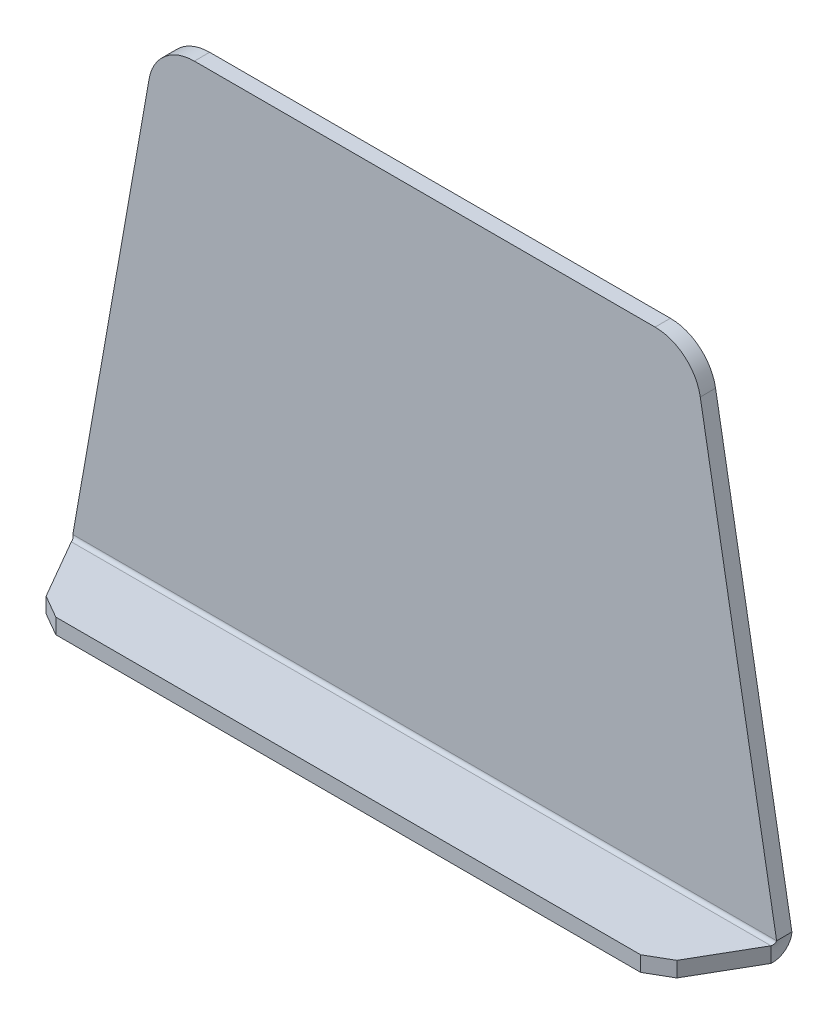
ISO-10303-21;
HEADER;
FILE_DESCRIPTION(('STEP AP214'),'2;1');
FILE_NAME('part.step','',(''),(''),'','','');
FILE_SCHEMA(('AUTOMOTIVE_DESIGN { 1 0 10303 214 1 1 1 1 }'));
ENDSEC;
DATA;
#1=APPLICATION_CONTEXT('core data for automotive mechanical design processes');
#2=APPLICATION_PROTOCOL_DEFINITION('international standard','automotive_design',2000,#1);
#3=PRODUCT_CONTEXT('',#1,'mechanical');
#4=PRODUCT('Part','Part','',(#3));
#5=PRODUCT_RELATED_PRODUCT_CATEGORY('part','',(#4));
#6=PRODUCT_DEFINITION_FORMATION('','',#4);
#7=PRODUCT_DEFINITION_CONTEXT('part definition',#1,'design');
#8=PRODUCT_DEFINITION('design','',#6,#7);
#9=PRODUCT_DEFINITION_SHAPE('','',#8);
#10=(LENGTH_UNIT() NAMED_UNIT(*) SI_UNIT(.MILLI.,.METRE.));
#11=(NAMED_UNIT(*) PLANE_ANGLE_UNIT() SI_UNIT($,.RADIAN.));
#12=(NAMED_UNIT(*) SI_UNIT($,.STERADIAN.) SOLID_ANGLE_UNIT());
#13=UNCERTAINTY_MEASURE_WITH_UNIT(LENGTH_MEASURE(1.E-05),#10,'distance_accuracy_value','');
#14=(GEOMETRIC_REPRESENTATION_CONTEXT(3) GLOBAL_UNCERTAINTY_ASSIGNED_CONTEXT((#13)) GLOBAL_UNIT_ASSIGNED_CONTEXT((#10,
#11,#12)) REPRESENTATION_CONTEXT('',''));
#15=CARTESIAN_POINT('',(0.,0.,0.));
#16=DIRECTION('',(0.,0.,1.));
#17=DIRECTION('',(1.,0.,0.));
#18=AXIS2_PLACEMENT_3D('',#15,#16,#17);
#19=CARTESIAN_POINT('',(0.,-0.7366,0.));
#20=DIRECTION('',(0.,1.,0.));
#21=DIRECTION('',(0.,0.,1.));
#22=AXIS2_PLACEMENT_3D('',#19,#20,#21);
#23=PLANE('',#22);
#24=DIRECTION('',(-0.500000000000017,0.,-0.866025403784429));
#25=VECTOR('',#24,1.);
#26=CARTESIAN_POINT('',(0.,-0.736599999999998,0.));
#27=LINE('',#26,#25);
#28=CARTESIAN_POINT('',(0.425276208285697,-0.736599999999999,0.736600000001023));
#29=VERTEX_POINT('',#28);
#30=CARTESIAN_POINT('',(7.57793552338496,-0.736599999999998,13.1253693429832));
#31=VERTEX_POINT('',#30);
#32=EDGE_CURVE('E137',#29,#31,#27,.F.);
#33=ORIENTED_EDGE('',*,*,#32,.T.);
#34=DIRECTION('',(-0.866025403784429,0.,-0.500000000000017));
#35=VECTOR('',#34,1.);
#36=CARTESIAN_POINT('',(7.5779355233849,-0.7366,13.1253693429833));
#37=LINE('',#36,#35);
#38=CARTESIAN_POINT('',(12.3404355233852,-0.7366,15.8749999999997));
#39=VERTEX_POINT('',#38);
#40=EDGE_CURVE('E170',#31,#39,#37,.F.);
#41=ORIENTED_EDGE('',*,*,#40,.T.);
#42=DIRECTION('',(-1.,0.,0.));
#43=VECTOR('',#42,1.);
#44=CARTESIAN_POINT('',(9.1654355233849,-0.7366,15.875));
#45=LINE('',#44,#43);
#46=CARTESIAN_POINT('',(133.709564476603,-0.7366,15.8749999999999));
#47=VERTEX_POINT('',#46);
#48=EDGE_CURVE('E159',#39,#47,#45,.F.);
#49=ORIENTED_EDGE('',*,*,#48,.T.);
#50=DIRECTION('',(-0.866025403784429,0.,0.500000000000017));
#51=VECTOR('',#50,1.);
#52=CARTESIAN_POINT('',(133.709564476602,-0.7366,15.875));
#53=LINE('',#52,#51);
#54=CARTESIAN_POINT('',(138.472064476603,-0.736599999999998,13.1253693429839));
#55=VERTEX_POINT('',#54);
#56=EDGE_CURVE('E146',#47,#55,#53,.F.);
#57=ORIENTED_EDGE('',*,*,#56,.T.);
#58=DIRECTION('',(-0.500000000000017,0.,0.866025403784429));
#59=VECTOR('',#58,1.);
#60=CARTESIAN_POINT('',(136.884564476602,-0.736599999999998,15.875));
#61=LINE('',#60,#59);
#62=CARTESIAN_POINT('',(145.624723791707,-0.736599999999999,0.736600000003302));
#63=VERTEX_POINT('',#62);
#64=EDGE_CURVE('E140',#55,#63,#61,.F.);
#65=ORIENTED_EDGE('',*,*,#64,.T.);
#66=DIRECTION('',(1.,0.,0.));
#67=VECTOR('',#66,1.);
#68=CARTESIAN_POINT('',(146.05,-0.7366,0.736600000002032));
#69=LINE('',#68,#67);
#70=EDGE_CURVE('E100',#63,#29,#69,.F.);
#71=ORIENTED_EDGE('',*,*,#70,.T.);
#72=EDGE_LOOP('',(#33,#41,#49,#57,#65,#71));
#73=FACE_BOUND('',#72,.T.);
#74=ADVANCED_FACE('F33',(#73),#23,.T.);
#75=CARTESIAN_POINT('',(7.5779355233849,-3.9116,13.1253693429833));
#76=DIRECTION('',(0.500000000000017,0.,-0.866025403784429));
#77=DIRECTION('',(-0.866025403784429,0.,-0.500000000000017));
#78=AXIS2_PLACEMENT_3D('',#75,#76,#77);
#79=PLANE('',#78);
#80=DIRECTION('',(0.,1.,0.));
#81=VECTOR('',#80,1.);
#82=CARTESIAN_POINT('',(12.3404355233851,-3.9116,15.875));
#83=LINE('',#82,#81);
#84=CARTESIAN_POINT('',(12.3404355233851,-3.9116,15.8749999999999));
#85=VERTEX_POINT('',#84);
#86=EDGE_CURVE('E167',#85,#39,#83,.T.);
#87=ORIENTED_EDGE('',*,*,#86,.T.);
#88=ORIENTED_EDGE('',*,*,#40,.F.);
#89=DIRECTION('',(0.,1.,0.));
#90=VECTOR('',#89,1.);
#91=CARTESIAN_POINT('',(7.57793552338497,-3.9116,13.1253693429832));
#92=LINE('',#91,#90);
#93=CARTESIAN_POINT('',(7.57793552338487,-3.91159993262504,13.1253693429831));
#94=VERTEX_POINT('',#93);
#95=EDGE_CURVE('E136',#31,#94,#92,.F.);
#96=ORIENTED_EDGE('',*,*,#95,.T.);
#97=DIRECTION('',(0.866025403784356,0.,0.500000000000143));
#98=VECTOR('',#97,1.);
#99=CARTESIAN_POINT('',(7.57793552338482,-3.9116,13.1253693429831));
#100=LINE('',#99,#98);
#101=EDGE_CURVE('E164',#94,#85,#100,.T.);
#102=ORIENTED_EDGE('',*,*,#101,.T.);
#103=EDGE_LOOP('',(#87,#88,#96,#102));
#104=FACE_BOUND('',#103,.T.);
#105=ADVANCED_FACE('F341',(#104),#79,.F.);
#106=CARTESIAN_POINT('',(9.1654355233849,-3.9116,15.875));
#107=DIRECTION('',(0.,0.,-1.));
#108=DIRECTION('',(-1.,0.,0.));
#109=AXIS2_PLACEMENT_3D('',#106,#107,#108);
#110=PLANE('',#109);
#111=DIRECTION('',(0.,1.,0.));
#112=VECTOR('',#111,1.);
#113=CARTESIAN_POINT('',(133.709564476603,-3.9116,15.8749999999998));
#114=LINE('',#113,#112);
#115=CARTESIAN_POINT('',(133.709564476603,-3.9116,15.8749999999998));
#116=VERTEX_POINT('',#115);
#117=EDGE_CURVE('E156',#116,#47,#114,.T.);
#118=ORIENTED_EDGE('',*,*,#117,.T.);
#119=ORIENTED_EDGE('',*,*,#48,.F.);
#120=ORIENTED_EDGE('',*,*,#86,.F.);
#121=DIRECTION('',(1.,0.,0.));
#122=VECTOR('',#121,1.);
#123=CARTESIAN_POINT('',(0.,-3.9116,15.8749999999999));
#124=LINE('',#123,#122);
#125=EDGE_CURVE('E153',#85,#116,#124,.T.);
#126=ORIENTED_EDGE('',*,*,#125,.T.);
#127=EDGE_LOOP('',(#118,#119,#120,#126));
#128=FACE_BOUND('',#127,.T.);
#129=ADVANCED_FACE('F340',(#128),#110,.F.);
#130=CARTESIAN_POINT('',(133.709564476602,-3.9116,15.875));
#131=DIRECTION('',(-0.500000000000017,0.,-0.866025403784429));
#132=DIRECTION('',(-0.866025403784429,0.,0.500000000000017));
#133=AXIS2_PLACEMENT_3D('',#130,#131,#132);
#134=PLANE('',#133);
#135=DIRECTION('',(0.,1.,0.));
#136=VECTOR('',#135,1.);
#137=CARTESIAN_POINT('',(138.472064476603,-3.9116,13.1253693429838));
#138=LINE('',#137,#136);
#139=CARTESIAN_POINT('',(138.472064476603,-3.9116,13.1253693429837));
#140=VERTEX_POINT('',#139);
#141=EDGE_CURVE('E143',#140,#55,#138,.T.);
#142=ORIENTED_EDGE('',*,*,#141,.T.);
#143=ORIENTED_EDGE('',*,*,#56,.F.);
#144=ORIENTED_EDGE('',*,*,#117,.F.);
#145=DIRECTION('',(0.866025403784358,0.,-0.50000000000014));
#146=VECTOR('',#145,1.);
#147=CARTESIAN_POINT('',(133.709564476603,-3.9116,15.8749999999999));
#148=LINE('',#147,#146);
#149=EDGE_CURVE('E149',#116,#140,#148,.T.);
#150=ORIENTED_EDGE('',*,*,#149,.T.);
#151=EDGE_LOOP('',(#142,#143,#144,#150));
#152=FACE_BOUND('',#151,.T.);
#153=ADVANCED_FACE('F336',(#152),#134,.F.);
#154=CARTESIAN_POINT('',(136.884564476602,-3.9116,15.875));
#155=DIRECTION('',(-0.866025403784429,0.,-0.500000000000017));
#156=DIRECTION('',(-0.500000000000017,0.,0.866025403784429));
#157=AXIS2_PLACEMENT_3D('',#154,#155,#156);
#158=PLANE('',#157);
#159=ORIENTED_EDGE('',*,*,#141,.F.);
#160=DIRECTION('',(0.500000000000639,0.,-0.86602540378407));
#161=VECTOR('',#160,1.);
#162=CARTESIAN_POINT('',(138.472064476602,-3.9116,13.1253693429836));
#163=LINE('',#162,#161);
#164=CARTESIAN_POINT('',(145.624723791718,-3.9116,0.736600000017147));
#165=VERTEX_POINT('',#164);
#166=EDGE_CURVE('E152',#140,#165,#163,.T.);
#167=ORIENTED_EDGE('',*,*,#166,.T.);
#168=DIRECTION('',(3.71810476437757E-12,-1.,8.74416762703518E-12));
#169=VECTOR('',#168,1.);
#170=CARTESIAN_POINT('',(145.624723791716,-2.3241794487742,0.736600000020483));
#171=LINE('',#170,#169);
#172=EDGE_CURVE('E102',#63,#165,#171,.T.);
#173=ORIENTED_EDGE('',*,*,#172,.F.);
#174=ORIENTED_EDGE('',*,*,#64,.F.);
#175=EDGE_LOOP('',(#159,#167,#173,#174));
#176=FACE_BOUND('',#175,.T.);
#177=ADVANCED_FACE('F285',(#176),#158,.F.);
#178=CARTESIAN_POINT('',(0.,-3.9116,0.));
#179=DIRECTION('',(0.866025403784429,0.,-0.500000000000017));
#180=DIRECTION('',(-0.500000000000017,0.,-0.866025403784429));
#181=AXIS2_PLACEMENT_3D('',#178,#179,#180);
#182=PLANE('',#181);
#183=ORIENTED_EDGE('',*,*,#95,.F.);
#184=ORIENTED_EDGE('',*,*,#32,.F.);
#185=DIRECTION('',(0.,1.,0.));
#186=VECTOR('',#185,1.);
#187=CARTESIAN_POINT('',(0.425276208285051,-2.32417944833777,0.736600000000027));
#188=LINE('',#187,#186);
#189=CARTESIAN_POINT('',(0.425276208285079,-3.9116,0.736599999999962));
#190=VERTEX_POINT('',#189);
#191=EDGE_CURVE('E259',#190,#29,#188,.T.);
#192=ORIENTED_EDGE('',*,*,#191,.F.);
#193=DIRECTION('',(0.500000000000011,0.,0.866025403784432));
#194=VECTOR('',#193,1.);
#195=CARTESIAN_POINT('',(0.425276208285123,-3.9116,0.736599999999977));
#196=LINE('',#195,#194);
#197=EDGE_CURVE('E175',#190,#94,#196,.T.);
#198=ORIENTED_EDGE('',*,*,#197,.T.);
#199=EDGE_LOOP('',(#183,#184,#192,#198));
#200=FACE_BOUND('',#199,.T.);
#201=ADVANCED_FACE('F252',(#200),#182,.F.);
#202=CARTESIAN_POINT('',(146.05,0.,0.7366));
#203=DIRECTION('',(1.,0.,0.));
#204=DIRECTION('',(0.,0.,-1.));
#205=AXIS2_PLACEMENT_3D('',#202,#203,#204);
#206=CYLINDRICAL_SURFACE('',#205,0.7366);
#207=CARTESIAN_POINT('',(0.425276208285126,-0.7366,0.736600000000531));
#208=CARTESIAN_POINT('',(0.409037997312572,-0.736645532031215,0.692411098372746));
#209=CARTESIAN_POINT('',(0.392800219051534,-0.732626542664837,0.648236597919797));
#210=CARTESIAN_POINT('',(0.360337381365451,-0.716794915196089,0.561343013066807));
#211=CARTESIAN_POINT('',(0.344112322585992,-0.70498875735479,0.518622749550487));
#212=CARTESIAN_POINT('',(0.311650856670122,-0.673908610866465,0.435963430839832));
#213=CARTESIAN_POINT('',(0.295414448204086,-0.654630514028472,0.396025919923243));
#214=CARTESIAN_POINT('',(0.262951298600167,-0.609247546599992,0.320252361012712));
#215=CARTESIAN_POINT('',(0.246724556035522,-0.583144522308115,0.28441520754209));
#216=CARTESIAN_POINT('',(0.214268537867195,-0.524956867281631,0.217996684682297));
#217=CARTESIAN_POINT('',(0.198039263522983,-0.492873501467408,0.187414206484605));
#218=CARTESIAN_POINT('',(0.165587315655498,-0.423751996807005,0.132479270520449));
#219=CARTESIAN_POINT('',(0.1493646419367,-0.386714017364265,0.108126612397055));
#220=CARTESIAN_POINT('',(0.116903065795082,-0.308862734561762,0.066423617463884));
#221=CARTESIAN_POINT('',(0.100664160019311,-0.268046774011185,0.0490782558487671));
#222=CARTESIAN_POINT('',(0.0682041350426444,-0.183997586516805,0.0219897426930793));
#223=CARTESIAN_POINT('',(0.0519830227925626,-0.140767825917321,0.0122359755743467));
#224=CARTESIAN_POINT('',(0.0298109572965363,-0.0809668785520732,0.00428223907434488));
#225=CARTESIAN_POINT('',(0.0238433380752711,-0.0648007299525648,0.00267577956754168));
#226=CARTESIAN_POINT('',(0.0119180842765506,-0.0324253547510727,0.000536012446991294));
#227=CARTESIAN_POINT('',(0.00596045006027034,-0.0162162489422923,8.75978410633538E-07));
#228=CARTESIAN_POINT('',(0.,-1.009528956236E-13,0.));
#229=B_SPLINE_CURVE_WITH_KNOTS('',3,(#207,#208,#209,#210,#211,#212,#213,#214,#215,#216,#217,
#218,#219,#220,#221,#222,#223,#224,#225,#226,#227,#228),.UNSPECIFIED.,.F.,.F.,(4,2,2,2,2,2,2,2,
2,2,4),(0.,0.141043225038912,0.281969225734052,0.422972819954025,0.563938308880143,
0.704874015526822,0.845805188977319,0.986836248727672,1.1276697439906,1.1795657073121,
1.23137300326773),.UNSPECIFIED.);
#230=CARTESIAN_POINT('',(2.72203961802735E-13,0.,0.));
#231=VERTEX_POINT('',#230);
#232=EDGE_CURVE('E113',#29,#231,#229,.T.);
#233=ORIENTED_EDGE('',*,*,#232,.F.);
#234=ORIENTED_EDGE('',*,*,#70,.F.);
#235=CARTESIAN_POINT('',(146.04999999999,1.10416885987528E-12,0.));
#236=CARTESIAN_POINT('',(146.033761789014,-0.0441889016253997,-4.55320315063034E-05));
#237=CARTESIAN_POINT('',(146.017524010753,-0.088363402078439,0.00397345733484365));
#238=CARTESIAN_POINT('',(145.985061173071,-0.175256986932504,0.0198050848037844));
#239=CARTESIAN_POINT('',(145.968836114294,-0.217977250449806,0.0316112426453038));
#240=CARTESIAN_POINT('',(145.936374648382,-0.300636569161503,0.0626913891340544));
#241=CARTESIAN_POINT('',(145.920138239916,-0.340574080078149,0.0819694859722547));
#242=CARTESIAN_POINT('',(145.887675090312,-0.416347638988351,0.127352453400751));
#243=CARTESIAN_POINT('',(145.871448347746,-0.452184792458588,0.153455477692438));
#244=CARTESIAN_POINT('',(145.838992329576,-0.518603315317709,0.211643132718414));
#245=CARTESIAN_POINT('',(145.822763055231,-0.549185793515125,0.243726498532311));
#246=CARTESIAN_POINT('',(145.790311107363,-0.604120729478959,0.312848003192191));
#247=CARTESIAN_POINT('',(145.774088433644,-0.628473387602309,0.349885982634734));
#248=CARTESIAN_POINT('',(145.741626857501,-0.670176382535689,0.427737265437253));
#249=CARTESIAN_POINT('',(145.725387951725,-0.687521744150972,0.468553225988092));
#250=CARTESIAN_POINT('',(145.692927926748,-0.71461025730696,0.552602413483231));
#251=CARTESIAN_POINT('',(145.676706814498,-0.724364024425833,0.59583217408321));
#252=CARTESIAN_POINT('',(145.654534749005,-0.732317760925926,0.65563312145027));
#253=CARTESIAN_POINT('',(145.648567129784,-0.733924220432747,0.671799270050513));
#254=CARTESIAN_POINT('',(145.636641875988,-0.736063987553237,0.704174645253672));
#255=CARTESIAN_POINT('',(145.630684241773,-0.736599124021739,0.720383751063386));
#256=CARTESIAN_POINT('',(145.624723791714,-0.7366,0.736600000006618));
#257=B_SPLINE_CURVE_WITH_KNOTS('',3,(#235,#236,#237,#238,#239,#240,#241,#242,#243,#244,#245,
#246,#247,#248,#249,#250,#251,#252,#253,#254,#255,#256),.UNSPECIFIED.,.F.,.F.,(4,2,2,2,2,2,2,2,
2,2,4),(0.,0.1410432250387,0.281969225733606,0.42297281995342,0.563938308879383,
0.704874015525665,0.845805188975765,0.986836248727495,1.12766974399172,1.17956570731438,
1.23137300327115),.UNSPECIFIED.);
#258=CARTESIAN_POINT('',(146.04999999999,-1.10579937885499E-13,0.));
#259=VERTEX_POINT('',#258);
#260=EDGE_CURVE('E40',#259,#63,#257,.T.);
#261=ORIENTED_EDGE('',*,*,#260,.F.);
#262=DIRECTION('',(-1.,0.,0.));
#263=VECTOR('',#262,1.);
#264=CARTESIAN_POINT('',(0.,2.5943691639437E-13,0.));
#265=LINE('',#264,#263);
#266=EDGE_CURVE('E98',#259,#231,#265,.T.);
#267=ORIENTED_EDGE('',*,*,#266,.T.);
#268=EDGE_LOOP('',(#233,#234,#261,#267));
#269=FACE_BOUND('',#268,.T.);
#270=ADVANCED_FACE('F97',(#269),#206,.F.);
#271=CARTESIAN_POINT('',(145.587612544005,-4.08738304657646,1.30062531070989));
#272=CARTESIAN_POINT('',(145.587613050227,-2.8970504975562,1.13636788014082));
#273=CARTESIAN_POINT('',(145.587613556423,-1.70671794853797,0.972110449572012));
#274=CARTESIAN_POINT('',(145.58761406262,-0.516385399518982,0.807853019003202));
#275=CARTESIAN_POINT('',(145.599984752966,-4.11389296873304,1.11373103709075));
#276=CARTESIAN_POINT('',(145.599985013113,-2.91584016529048,1.00390181703589));
#277=CARTESIAN_POINT('',(145.59998527326,-1.71778736184614,0.89407259698077));
#278=CARTESIAN_POINT('',(145.599985533432,-0.519734558402312,0.784243376925908));
#279=CARTESIAN_POINT('',(145.647805286687,-4.16445919940632,0.384702751266314));
#280=CARTESIAN_POINT('',(145.647804928217,-2.9516804357434,0.487183613372252));
#281=CARTESIAN_POINT('',(145.647804569721,-1.73890167207972,0.589664475478444));
#282=CARTESIAN_POINT('',(145.647804211251,-0.526122908416798,0.692145337584382));
#283=CARTESIAN_POINT('',(145.731039991693,-3.91208361052884,-0.883754332543426));
#284=CARTESIAN_POINT('',(145.73104011468,-2.7728019939582,-0.411873159233492));
#285=CARTESIAN_POINT('',(145.731040237641,-1.63352037739061,0.0600080140765182));
#286=CARTESIAN_POINT('',(145.731040360628,-0.494238760822,0.531889187386376));
#287=CARTESIAN_POINT('',(145.837361895838,-2.99420532751336,-2.25760532654384));
#288=CARTESIAN_POINT('',(145.837361895838,-2.12222919865427,-1.38562919796898));
#289=CARTESIAN_POINT('',(145.837361895838,-1.25025306979595,-0.513653069394372));
#290=CARTESIAN_POINT('',(145.837361895838,-0.378276940937874,0.35832305918049));
#291=CARTESIAN_POINT('',(145.943683800085,-1.62035432965951,-3.17548361151944));
#292=CARTESIAN_POINT('',(145.943683677098,-1.14847315719413,-2.03620199466076));
#293=CARTESIAN_POINT('',(145.943683554112,-0.676591984728996,-0.89692037780285));
#294=CARTESIAN_POINT('',(145.943683431125,-0.204710812263688,0.242361239054861));
#295=CARTESIAN_POINT('',(146.026923596928,-0.351819656636902,-3.42787463672622));
#296=CARTESIAN_POINT('',(146.026923955423,-0.249361390903069,-2.21509137738751));
#297=CARTESIAN_POINT('',(146.026924313919,-0.146903125169235,-1.00230811804905));
#298=CARTESIAN_POINT('',(146.026924672414,-0.0444448594354018,0.21047514128916));
#299=CARTESIAN_POINT('',(146.074749227311,0.377286366246688,-3.377282194622));
#300=CARTESIAN_POINT('',(146.074748967012,0.267411910700382,-2.17923252882849));
#301=CARTESIAN_POINT('',(146.074748706713,0.157537455154152,-0.981182863033702));
#302=CARTESIAN_POINT('',(146.074748446414,0.0476629996078208,0.21686680276093));
#303=CARTESIAN_POINT('',(146.087126533037,0.564256217279822,-3.35075029134352));
#304=CARTESIAN_POINT('',(146.08712602651,0.399931541018478,-2.16042728134431));
#305=CARTESIAN_POINT('',(146.087125519983,0.235606864757236,-0.970104271346124));
#306=CARTESIAN_POINT('',(146.087125013482,0.071282188495917,0.220218738652041));
#307=B_SPLINE_SURFACE_WITH_KNOTS('',3,3,((#271,#272,#273,#274),(#275,#276,#277,#278),(#279,#280,
#281,#282),(#283,#284,#285,#286),(#287,#288,#289,#290),(#291,#292,#293,#294),(#295,#296,#297,
#298),(#299,#300,#301,#302),(#303,#304,#305,#306)),.UNSPECIFIED.,.F.,.F.,.F.,(4,1,1,1,1,1,4),(4,
4),(-0.08723626480821,0.,0.2500000000036,0.5000000000014,0.7499999999991,1.,1.087272189861),
(4.543612969893E-08,0.9999983845735),.UNSPECIFIED.);
#308=CARTESIAN_POINT('',(146.050000000012,-1.38098531700796E-12,-3.175));
#309=CARTESIAN_POINT('',(146.042366379942,-0.110287051827272,-3.1750106504649));
#310=CARTESIAN_POINT('',(146.034733349952,-0.220569103956156,-3.17033574655555));
#311=CARTESIAN_POINT('',(146.019468097599,-0.440340357702249,-3.15169721503875));
#312=CARTESIAN_POINT('',(146.011835875214,-0.549829597303804,-3.13773403545746));
#313=CARTESIAN_POINT('',(145.99657690979,-0.767160833072922,-3.10061538433097));
#314=CARTESIAN_POINT('',(145.988950166979,-0.875004013999934,-3.07746688270374));
#315=CARTESIAN_POINT('',(145.973697635792,-1.0883240570705,-3.02216621495015));
#316=CARTESIAN_POINT('',(145.966071847405,-1.19380094819719,-2.99001415916756));
#317=CARTESIAN_POINT('',(145.943187600084,-1.50565949116431,-2.88031381871406));
#318=CARTESIAN_POINT('',(145.927916173151,-1.70755692063788,-2.78950626613425));
#319=CARTESIAN_POINT('',(145.897391584483,-2.09304157278728,-2.57526926086313));
#320=CARTESIAN_POINT('',(145.882138419965,-2.27663206998096,-2.45184565659623));
#321=CARTESIAN_POINT('',(145.851623266357,-2.62045073735816,-2.17585904842733));
#322=CARTESIAN_POINT('',(145.836361277541,-2.78067959717662,-2.02329690500151));
#323=CARTESIAN_POINT('',(145.805840405345,-3.07320364485436,-1.69334983956939));
#324=CARTESIAN_POINT('',(145.790581523229,-3.20549314300714,-1.51595987371127));
#325=CARTESIAN_POINT('',(145.760058137519,-3.43835377276593,-1.14142802738979));
#326=CARTESIAN_POINT('',(145.744793633414,-3.53891840324435,-0.944282109386753));
#327=CARTESIAN_POINT('',(145.714267861358,-3.70538095861549,-0.535920177982778));
#328=CARTESIAN_POINT('',(145.69900659717,-3.77130012039346,-0.324712873568563));
#329=CARTESIAN_POINT('',(145.673908650463,-3.849760815651,0.0293177148548527));
#330=CARTESIAN_POINT('',(145.664064602811,-3.87293787192357,0.169874407033383));
#331=CARTESIAN_POINT('',(145.644390251639,-3.903854455118,0.452467602051468));
#332=CARTESIAN_POINT('',(145.634559949003,-3.91161643825406,0.594501648836051));
#333=CARTESIAN_POINT('',(145.624723791727,-3.91159999999999,0.736600000014321));
#334=B_SPLINE_CURVE_WITH_KNOTS('',3,(#308,#309,#310,#311,#312,#313,#314,#315,#316,#317,#318,
#319,#320,#321,#322,#323,#324,#325,#326,#327,#328,#329,#330,#331,#332,#333),.UNSPECIFIED.,.F.,
.F.,(4,2,2,2,2,2,2,2,2,2,2,2,4),(0.,0.331544885302929,0.663073779477026,0.994351585685525,
1.3256253320707,1.9879079977878,2.6500719892689,3.31221642972612,3.97449558273063,
4.63691036336615,5.29891862381988,5.726519843042,6.15349768742011),.UNSPECIFIED.);
#335=CARTESIAN_POINT('',(146.050000000001,-1.19016658650738E-12,-3.175));
#336=VERTEX_POINT('',#335);
#337=EDGE_CURVE('E59',#336,#165,#334,.T.);
#338=DIRECTION('',(0.,0.,1.));
#339=VECTOR('',#338,1.);
#340=CARTESIAN_POINT('',(146.049999999991,-1.31838984174237E-12,-3.175));
#341=LINE('',#340,#339);
#342=EDGE_CURVE('E115',#259,#336,#341,.F.);
#343=ORIENTED_EDGE('',*,*,#337,.F.);
#344=ORIENTED_EDGE('',*,*,#342,.F.);
#345=ORIENTED_EDGE('',*,*,#260,.T.);
#346=ORIENTED_EDGE('',*,*,#172,.T.);
#347=EDGE_LOOP('',(#343,#344,#345,#346));
#348=FACE_BOUND('',#347,.T.);
#349=ADVANCED_FACE('F116',(#348),#307,.T.);
#350=CARTESIAN_POINT('',(0.,-3.9116,0.));
#351=DIRECTION('',(0.,1.,0.));
#352=DIRECTION('',(0.,0.,1.));
#353=AXIS2_PLACEMENT_3D('',#350,#351,#352);
#354=PLANE('',#353);
#355=ORIENTED_EDGE('',*,*,#149,.F.);
#356=ORIENTED_EDGE('',*,*,#125,.F.);
#357=ORIENTED_EDGE('',*,*,#101,.F.);
#358=ORIENTED_EDGE('',*,*,#197,.F.);
#359=DIRECTION('',(1.,0.,0.));
#360=VECTOR('',#359,1.);
#361=CARTESIAN_POINT('',(146.05,-3.9116,0.736599999999931));
#362=LINE('',#361,#360);
#363=EDGE_CURVE('E213',#165,#190,#362,.F.);
#364=ORIENTED_EDGE('',*,*,#363,.F.);
#365=ORIENTED_EDGE('',*,*,#166,.F.);
#366=EDGE_LOOP('',(#355,#356,#357,#358,#364,#365));
#367=FACE_BOUND('',#366,.T.);
#368=ADVANCED_FACE('F246',(#367),#354,.F.);
#369=CARTESIAN_POINT('',(-0.0371112477279784,0.564025310545294,-3.35078304571794));
#370=CARTESIAN_POINT('',(-0.0371107415195166,0.399767880029316,-2.16045049698521));
#371=CARTESIAN_POINT('',(-0.0371102353110294,0.23551044951344,-0.970117948252476));
#372=CARTESIAN_POINT('',(-0.0371097291025676,0.0712530189974616,0.22021460048018));
#373=CARTESIAN_POINT('',(-0.0247390387692429,0.37713103697213,-3.3772929678669));
#374=CARTESIAN_POINT('',(-0.0247387786113913,0.267301816955114,-2.17924016471238));
#375=CARTESIAN_POINT('',(-0.0247385184535372,0.157472596938047,-0.981187361557598));
#376=CARTESIAN_POINT('',(-0.0247382582956857,0.0476433769210058,0.216865441597231));
#377=CARTESIAN_POINT('',(0.02308149496865,-0.351897248678568,-3.4278591985224));
#378=CARTESIAN_POINT('',(0.0230811364953284,-0.249416386591883,-2.2150804351531));
#379=CARTESIAN_POINT('',(0.0230807780220092,-0.146935524505122,-1.00230167178482));
#380=CARTESIAN_POINT('',(0.0230804195486901,-0.0444546624183866,0.21047709158338));
#381=CARTESIAN_POINT('',(0.106316199983177,-1.62035433220078,-3.17548360969826));
#382=CARTESIAN_POINT('',(0.106316322962306,-1.14847315900489,-2.03620199340677));
#383=CARTESIAN_POINT('',(0.106316445941435,-0.676591985809258,-0.89692037711451));
#384=CARTESIAN_POINT('',(0.106316568920564,-0.204710812613599,0.242361239178));
#385=CARTESIAN_POINT('',(0.21263810413018,-2.99420532591062,-2.25760532687861));
#386=CARTESIAN_POINT('',(0.212638104130714,-2.12222919754683,-1.38562919823162));
#387=CARTESIAN_POINT('',(0.212638104131247,-1.2502530691833,-0.513653069584872));
#388=CARTESIAN_POINT('',(0.21263810413178,-0.37827694081951,0.358323059062126));
#389=CARTESIAN_POINT('',(0.318960008351504,-3.91208361068886,-0.883754329316864));
#390=CARTESIAN_POINT('',(0.318959885370038,-2.77280199410806,-0.41187315696578));
#391=CARTESIAN_POINT('',(0.318959762388826,-1.63352037752675,0.060008015385431));
#392=CARTESIAN_POINT('',(0.31895963940736,-0.49423876094519,0.531889187736388));
#393=CARTESIAN_POINT('',(0.40219980519873,-4.1644746358423,0.384780343425328));
#394=CARTESIAN_POINT('',(0.40220016370703,-2.95169137679848,0.487238609138054));
#395=CARTESIAN_POINT('',(0.402200522215076,-1.73890811775466,0.589696874850526));
#396=CARTESIAN_POINT('',(0.402200880723122,-0.526124858710586,0.692155140563252));
#397=CARTESIAN_POINT('',(0.450025435581822,-4.11388219375332,1.11388636614229));
#398=CARTESIAN_POINT('',(0.45002517528821,-2.91583252824962,1.00401191062977));
#399=CARTESIAN_POINT('',(0.450024914994598,-1.71778286274389,0.894137455117246));
#400=CARTESIAN_POINT('',(0.450024654700986,-0.519733197239172,0.784262999604722));
#401=CARTESIAN_POINT('',(0.462402741310778,-4.08735029047992,1.30085621712996));
#402=CARTESIAN_POINT('',(0.462402234790582,-2.89702728077002,1.13653154091739));
#403=CARTESIAN_POINT('',(0.46240172827064,-1.70670427105885,0.97220686470481));
#404=CARTESIAN_POINT('',(0.462401221750444,-0.516381261348442,0.80788218849198));
#405=B_SPLINE_SURFACE_WITH_KNOTS('',3,3,((#369,#370,#371,#372),(#373,#374,#375,#376),(#377,#378,
#379,#380),(#381,#382,#383,#384),(#385,#386,#387,#388),(#389,#390,#391,#392),(#393,#394,#395,
#396),(#397,#398,#399,#400),(#401,#402,#403,#404)),.UNSPECIFIED.,.F.,.F.,.F.,(4,1,1,1,1,1,4),(4,
4),(-0.08723626480589,0.,0.2499999999998,0.4999999999998,0.7499999999997,1.,1.08727218986),
(4.505509384328E-08,0.9999983845735),.UNSPECIFIED.);
#406=DIRECTION('',(0.,0.,1.));
#407=VECTOR('',#406,1.);
#408=CARTESIAN_POINT('',(0.,-1.56727336311572E-13,-3.175));
#409=LINE('',#408,#407);
#410=CARTESIAN_POINT('',(2.22507802339415E-13,-3.40509861090282E-13,-3.175));
#411=VERTEX_POINT('',#410);
#412=EDGE_CURVE('E134',#411,#231,#409,.T.);
#413=CARTESIAN_POINT('',(0.425276208285082,-3.9116,0.73659999999994));
#414=CARTESIAN_POINT('',(0.417642588215209,-3.91161065046493,0.626312948174086));
#415=CARTESIAN_POINT('',(0.410009558225255,-3.90693574655563,0.516030896045251));
#416=CARTESIAN_POINT('',(0.394744305871504,-3.88829721503892,0.296259642299259));
#417=CARTESIAN_POINT('',(0.387112083486511,-3.87433403545768,0.186770402697756));
#418=CARTESIAN_POINT('',(0.371853118062376,-3.8372153843313,-0.0305608330712728));
#419=CARTESIAN_POINT('',(0.364226375251217,-3.81406688270412,-0.138404013998248));
#420=CARTESIAN_POINT('',(0.348973844063801,-3.75876621495065,-0.351724057068757));
#421=CARTESIAN_POINT('',(0.341348055676994,-3.72661415916812,-0.457200948195431));
#422=CARTESIAN_POINT('',(0.318463808356455,-3.61691381871478,-0.769059491162571));
#423=CARTESIAN_POINT('',(0.303192381425547,-3.52610626613506,-0.970956920636232));
#424=CARTESIAN_POINT('',(0.272667792761879,-3.31186926086402,-1.35644157278587));
#425=CARTESIAN_POINT('',(0.257414628246534,-3.18844565659713,-1.54003206997969));
#426=CARTESIAN_POINT('',(0.226899474643107,-2.91245904842836,-1.88385073735699));
#427=CARTESIAN_POINT('',(0.211637485828876,-2.75989690500269,-2.04407959717544));
#428=CARTESIAN_POINT('',(0.181116613634885,-2.42994983957096,-2.33660364485311));
#429=CARTESIAN_POINT('',(0.165857731518638,-2.25255987371308,-2.46889314300585));
#430=CARTESIAN_POINT('',(0.13533434580836,-1.87802802739212,-2.70175377276465));
#431=CARTESIAN_POINT('',(0.120069841703048,-1.68088210938934,-2.80231840324311));
#432=CARTESIAN_POINT('',(0.0895440696449873,-1.27252017798591,-2.96878095861441));
#433=CARTESIAN_POINT('',(0.0742828054551584,-1.06131287357198,-3.03470012039248));
#434=CARTESIAN_POINT('',(0.0491848587453276,-0.707282285150673,-3.11316081564992));
#435=CARTESIAN_POINT('',(0.0393408110916129,-0.566725592973975,-3.13633787192242));
#436=CARTESIAN_POINT('',(0.0196664599157867,-0.284132397959611,-3.16725445511713));
#437=CARTESIAN_POINT('',(0.00983615727848375,-0.142098351176917,-3.17501643825352));
#438=CARTESIAN_POINT('',(0.,-5.37278934763571E-13,-3.17499999999999));
#439=B_SPLINE_CURVE_WITH_KNOTS('',3,(#413,#414,#415,#416,#417,#418,#419,#420,#421,#422,#423,
#424,#425,#426,#427,#428,#429,#430,#431,#432,#433,#434,#435,#436,#437,#438),.UNSPECIFIED.,.F.,
.F.,(4,2,2,2,2,2,2,2,2,2,2,2,4),(0.,0.331544885302813,0.663073779476795,0.994351585685186,
1.32562533207025,1.98790799778716,2.65007198926807,3.31221642972456,3.97449558272836,
4.63691036336343,5.2989186238167,5.7265198430337,6.15349768740668),.UNSPECIFIED.);
#440=EDGE_CURVE('E206',#190,#411,#439,.T.);
#441=ORIENTED_EDGE('',*,*,#412,.F.);
#442=ORIENTED_EDGE('',*,*,#440,.F.);
#443=ORIENTED_EDGE('',*,*,#191,.T.);
#444=ORIENTED_EDGE('',*,*,#232,.T.);
#445=EDGE_LOOP('',(#441,#442,#443,#444));
#446=FACE_BOUND('',#445,.T.);
#447=ADVANCED_FACE('F35',(#446),#405,.T.);
#448=CARTESIAN_POINT('',(0.,0.,0.));
#449=DIRECTION('',(0.,0.,-1.));
#450=DIRECTION('',(-1.,0.,0.));
#451=AXIS2_PLACEMENT_3D('',#448,#449,#450);
#452=PLANE('',#451);
#453=CARTESIAN_POINT('',(25.217524609206,88.1634,0.));
#454=DIRECTION('',(0.,0.,1.));
#455=DIRECTION('',(1.,0.,0.));
#456=AXIS2_PLACEMENT_3D('',#453,#454,#455);
#457=CIRCLE('',#456,9.525);
#458=CARTESIAN_POINT('',(15.8372307617597,89.817398892261,0.));
#459=VERTEX_POINT('',#458);
#460=CARTESIAN_POINT('',(25.217524609206,97.6884,0.));
#461=VERTEX_POINT('',#460);
#462=EDGE_CURVE('E260',#459,#461,#457,.F.);
#463=ORIENTED_EDGE('',*,*,#462,.F.);
#464=DIRECTION('',(-0.173648177666902,-0.984807753012213,0.));
#465=VECTOR('',#464,1.);
#466=CARTESIAN_POINT('',(0.,0.,0.));
#467=LINE('',#466,#465);
#468=EDGE_CURVE('E111',#231,#459,#467,.F.);
#469=ORIENTED_EDGE('',*,*,#468,.F.);
#470=ORIENTED_EDGE('',*,*,#266,.F.);
#471=DIRECTION('',(-0.173648177666902,0.984807753012213,0.));
#472=VECTOR('',#471,1.);
#473=CARTESIAN_POINT('',(128.824899377753,97.6884,0.));
#474=LINE('',#473,#472);
#475=CARTESIAN_POINT('',(130.212769238224,89.8173988923122,0.));
#476=VERTEX_POINT('',#475);
#477=EDGE_CURVE('E109',#476,#259,#474,.F.);
#478=ORIENTED_EDGE('',*,*,#477,.F.);
#479=CARTESIAN_POINT('',(120.832475390802,88.1634,0.));
#480=DIRECTION('',(0.,0.,1.));
#481=DIRECTION('',(1.,0.,0.));
#482=AXIS2_PLACEMENT_3D('',#479,#480,#481);
#483=CIRCLE('',#482,9.525);
#484=CARTESIAN_POINT('',(120.832475390802,97.6884,0.));
#485=VERTEX_POINT('',#484);
#486=EDGE_CURVE('E124',#485,#476,#483,.F.);
#487=ORIENTED_EDGE('',*,*,#486,.F.);
#488=DIRECTION('',(1.,0.,0.));
#489=VECTOR('',#488,1.);
#490=CARTESIAN_POINT('',(17.2251006222419,97.6884,0.));
#491=LINE('',#490,#489);
#492=EDGE_CURVE('E129',#461,#485,#491,.T.);
#493=ORIENTED_EDGE('',*,*,#492,.F.);
#494=EDGE_LOOP('',(#463,#469,#470,#478,#487,#493));
#495=FACE_BOUND('',#494,.T.);
#496=ADVANCED_FACE('F106',(#495),#452,.F.);
#497=CARTESIAN_POINT('',(0.,0.,-3.175));
#498=DIRECTION('',(-0.984807753012213,0.173648177666902,0.));
#499=DIRECTION('',(-0.173648177666902,-0.984807753012213,0.));
#500=AXIS2_PLACEMENT_3D('',#497,#498,#499);
#501=PLANE('',#500);
#502=DIRECTION('',(0.173648177666928,0.984807753012208,0.));
#503=VECTOR('',#502,1.);
#504=CARTESIAN_POINT('',(2.46393728873179E-13,-2.05046040194621E-13,-3.175));
#505=LINE('',#504,#503);
#506=CARTESIAN_POINT('',(15.837230761761,89.8173988922609,-3.175));
#507=VERTEX_POINT('',#506);
#508=EDGE_CURVE('E205',#411,#507,#505,.T.);
#509=ORIENTED_EDGE('',*,*,#508,.F.);
#510=ORIENTED_EDGE('',*,*,#412,.T.);
#511=ORIENTED_EDGE('',*,*,#468,.T.);
#512=DIRECTION('',(0.,0.,1.));
#513=VECTOR('',#512,1.);
#514=CARTESIAN_POINT('',(15.8372307617588,89.817398892244,-3.175));
#515=LINE('',#514,#513);
#516=EDGE_CURVE('E261',#507,#459,#515,.T.);
#517=ORIENTED_EDGE('',*,*,#516,.F.);
#518=EDGE_LOOP('',(#509,#510,#511,#517));
#519=FACE_BOUND('',#518,.T.);
#520=ADVANCED_FACE('F239',(#519),#501,.T.);
#521=CARTESIAN_POINT('',(25.217524609206,88.1634,-3.175));
#522=DIRECTION('',(0.,0.,1.));
#523=DIRECTION('',(1.,0.,0.));
#524=AXIS2_PLACEMENT_3D('',#521,#522,#523);
#525=CYLINDRICAL_SURFACE('',#524,9.525);
#526=ORIENTED_EDGE('',*,*,#462,.T.);
#527=DIRECTION('',(0.,0.,1.));
#528=VECTOR('',#527,1.);
#529=CARTESIAN_POINT('',(25.217524609206,97.6884,-3.175));
#530=LINE('',#529,#528);
#531=CARTESIAN_POINT('',(25.217524609206,97.6884,-3.175));
#532=VERTEX_POINT('',#531);
#533=EDGE_CURVE('E132',#532,#461,#530,.T.);
#534=ORIENTED_EDGE('',*,*,#533,.F.);
#535=CARTESIAN_POINT('',(25.217524609206,88.1634,-3.175));
#536=DIRECTION('',(0.,0.,1.));
#537=DIRECTION('',(1.,0.,0.));
#538=AXIS2_PLACEMENT_3D('',#535,#536,#537);
#539=CIRCLE('',#538,9.525);
#540=EDGE_CURVE('E202',#507,#532,#539,.F.);
#541=ORIENTED_EDGE('',*,*,#540,.F.);
#542=ORIENTED_EDGE('',*,*,#516,.T.);
#543=EDGE_LOOP('',(#526,#534,#541,#542));
#544=FACE_BOUND('',#543,.T.);
#545=ADVANCED_FACE('F235',(#544),#525,.T.);
#546=CARTESIAN_POINT('',(17.2251006222419,97.6884,-3.175));
#547=DIRECTION('',(0.,1.,0.));
#548=DIRECTION('',(0.,0.,1.));
#549=AXIS2_PLACEMENT_3D('',#546,#547,#548);
#550=PLANE('',#549);
#551=ORIENTED_EDGE('',*,*,#492,.T.);
#552=DIRECTION('',(0.,0.,1.));
#553=VECTOR('',#552,1.);
#554=CARTESIAN_POINT('',(120.832475390802,97.6884,-3.175));
#555=LINE('',#554,#553);
#556=CARTESIAN_POINT('',(120.832475390802,97.6884,-3.175));
#557=VERTEX_POINT('',#556);
#558=EDGE_CURVE('E131',#557,#485,#555,.T.);
#559=ORIENTED_EDGE('',*,*,#558,.F.);
#560=DIRECTION('',(-1.,0.,0.));
#561=VECTOR('',#560,1.);
#562=CARTESIAN_POINT('',(0.,97.6884,-3.175));
#563=LINE('',#562,#561);
#564=EDGE_CURVE('E201',#532,#557,#563,.F.);
#565=ORIENTED_EDGE('',*,*,#564,.F.);
#566=ORIENTED_EDGE('',*,*,#533,.T.);
#567=EDGE_LOOP('',(#551,#559,#565,#566));
#568=FACE_BOUND('',#567,.T.);
#569=ADVANCED_FACE('F231',(#568),#550,.T.);
#570=CARTESIAN_POINT('',(120.832475390802,88.1634,-3.175));
#571=DIRECTION('',(0.,0.,1.));
#572=DIRECTION('',(1.,0.,0.));
#573=AXIS2_PLACEMENT_3D('',#570,#571,#572);
#574=CYLINDRICAL_SURFACE('',#573,9.525);
#575=ORIENTED_EDGE('',*,*,#486,.T.);
#576=DIRECTION('',(0.,0.,1.));
#577=VECTOR('',#576,1.);
#578=CARTESIAN_POINT('',(130.212769238218,89.8173988923494,-3.175));
#579=LINE('',#578,#577);
#580=CARTESIAN_POINT('',(130.21276923823,89.8173988923131,-3.175));
#581=VERTEX_POINT('',#580);
#582=EDGE_CURVE('E122',#581,#476,#579,.T.);
#583=ORIENTED_EDGE('',*,*,#582,.F.);
#584=CARTESIAN_POINT('',(120.832475390802,88.1634,-3.175));
#585=DIRECTION('',(0.,0.,1.));
#586=DIRECTION('',(1.,0.,0.));
#587=AXIS2_PLACEMENT_3D('',#584,#585,#586);
#588=CIRCLE('',#587,9.525);
#589=EDGE_CURVE('E198',#557,#581,#588,.F.);
#590=ORIENTED_EDGE('',*,*,#589,.F.);
#591=ORIENTED_EDGE('',*,*,#558,.T.);
#592=EDGE_LOOP('',(#575,#583,#590,#591));
#593=FACE_BOUND('',#592,.T.);
#594=ADVANCED_FACE('F228',(#593),#574,.T.);
#595=CARTESIAN_POINT('',(128.824899377753,97.6884,-3.175));
#596=DIRECTION('',(0.984807753012213,0.173648177666902,0.));
#597=DIRECTION('',(-0.173648177666902,0.984807753012213,0.));
#598=AXIS2_PLACEMENT_3D('',#595,#596,#597);
#599=PLANE('',#598);
#600=ORIENTED_EDGE('',*,*,#477,.T.);
#601=ORIENTED_EDGE('',*,*,#342,.T.);
#602=DIRECTION('',(0.173648177666883,-0.984807753012216,0.));
#603=VECTOR('',#602,1.);
#604=CARTESIAN_POINT('',(130.212769238228,89.8173988923512,-3.175));
#605=LINE('',#604,#603);
#606=EDGE_CURVE('E50',#581,#336,#605,.T.);
#607=ORIENTED_EDGE('',*,*,#606,.F.);
#608=ORIENTED_EDGE('',*,*,#582,.T.);
#609=EDGE_LOOP('',(#600,#601,#607,#608));
#610=FACE_BOUND('',#609,.T.);
#611=ADVANCED_FACE('F121',(#610),#599,.T.);
#612=CARTESIAN_POINT('',(146.05,0.,0.7366));
#613=DIRECTION('',(1.,0.,0.));
#614=DIRECTION('',(0.,0.,-1.));
#615=AXIS2_PLACEMENT_3D('',#612,#613,#614);
#616=CYLINDRICAL_SURFACE('',#615,3.9116);
#617=ORIENTED_EDGE('',*,*,#363,.T.);
#618=ORIENTED_EDGE('',*,*,#440,.T.);
#619=DIRECTION('',(-1.,0.,0.));
#620=VECTOR('',#619,1.);
#621=CARTESIAN_POINT('',(0.,-6.80305870271238E-13,-3.175));
#622=LINE('',#621,#620);
#623=EDGE_CURVE('E11',#336,#411,#622,.T.);
#624=ORIENTED_EDGE('',*,*,#623,.F.);
#625=ORIENTED_EDGE('',*,*,#337,.T.);
#626=EDGE_LOOP('',(#617,#618,#624,#625));
#627=FACE_BOUND('',#626,.T.);
#628=ADVANCED_FACE('F218',(#627),#616,.T.);
#629=CARTESIAN_POINT('',(0.,0.,-3.175));
#630=DIRECTION('',(0.,0.,-1.));
#631=DIRECTION('',(-1.,0.,0.));
#632=AXIS2_PLACEMENT_3D('',#629,#630,#631);
#633=PLANE('',#632);
#634=ORIENTED_EDGE('',*,*,#606,.T.);
#635=ORIENTED_EDGE('',*,*,#623,.T.);
#636=ORIENTED_EDGE('',*,*,#508,.T.);
#637=ORIENTED_EDGE('',*,*,#540,.T.);
#638=ORIENTED_EDGE('',*,*,#564,.T.);
#639=ORIENTED_EDGE('',*,*,#589,.T.);
#640=EDGE_LOOP('',(#634,#635,#636,#637,#638,#639));
#641=FACE_BOUND('',#640,.T.);
#642=ADVANCED_FACE('F223',(#641),#633,.T.);
#643=CLOSED_SHELL('',(#74,#105,#129,#153,#177,#201,#270,#349,#368,#447,#496,#520,#545,#569,#594,
#611,#628,#642));
#644=MANIFOLD_SOLID_BREP('B2',#643);
#645=ADVANCED_BREP_SHAPE_REPRESENTATION('',(#18,#644),#14);
#646=SHAPE_DEFINITION_REPRESENTATION(#9,#645);
ENDSEC;
END-ISO-10303-21;
